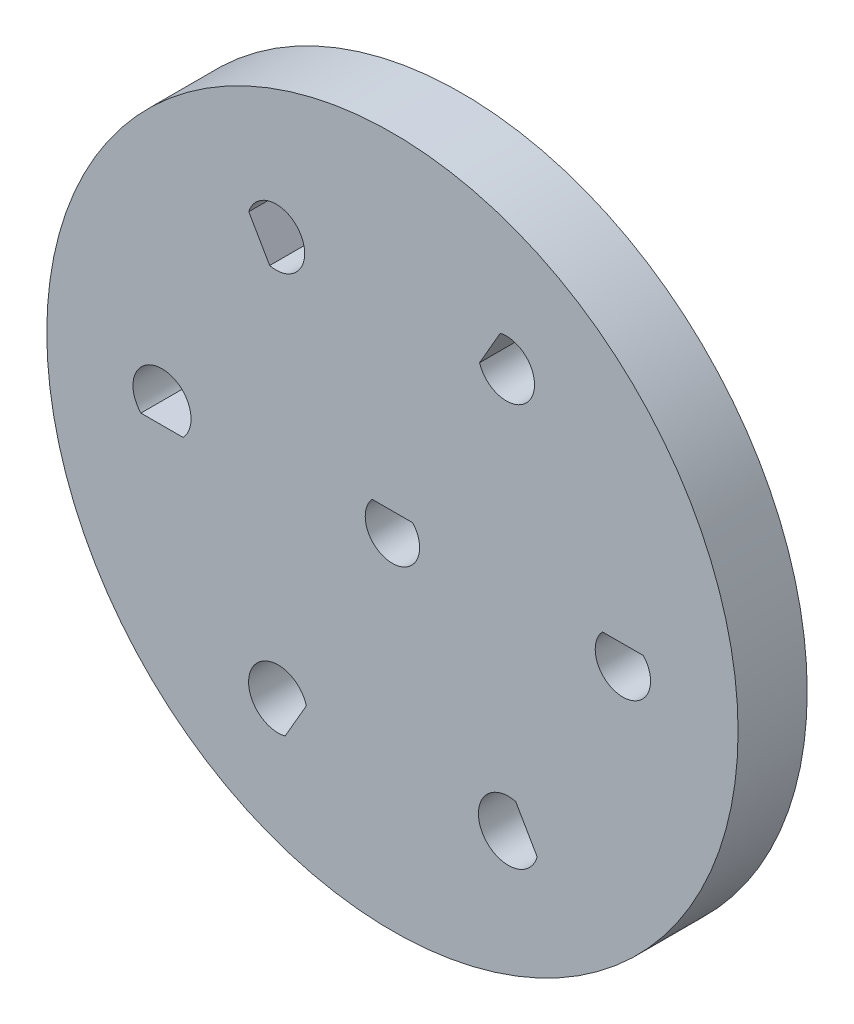
ISO-10303-21;
HEADER;
FILE_DESCRIPTION(('STEP AP214'),'2;1');
FILE_NAME('part.step','',(''),(''),'','','');
FILE_SCHEMA(('AUTOMOTIVE_DESIGN { 1 0 10303 214 1 1 1 1 }'));
ENDSEC;
DATA;
#1=APPLICATION_CONTEXT('core data for automotive mechanical design processes');
#2=APPLICATION_PROTOCOL_DEFINITION('international standard','automotive_design',2000,#1);
#3=PRODUCT_CONTEXT('',#1,'mechanical');
#4=PRODUCT('Part','Part','',(#3));
#5=PRODUCT_RELATED_PRODUCT_CATEGORY('part','',(#4));
#6=PRODUCT_DEFINITION_FORMATION('','',#4);
#7=PRODUCT_DEFINITION_CONTEXT('part definition',#1,'design');
#8=PRODUCT_DEFINITION('design','',#6,#7);
#9=PRODUCT_DEFINITION_SHAPE('','',#8);
#10=(LENGTH_UNIT() NAMED_UNIT(*) SI_UNIT(.MILLI.,.METRE.));
#11=(NAMED_UNIT(*) PLANE_ANGLE_UNIT() SI_UNIT($,.RADIAN.));
#12=(NAMED_UNIT(*) SI_UNIT($,.STERADIAN.) SOLID_ANGLE_UNIT());
#13=UNCERTAINTY_MEASURE_WITH_UNIT(LENGTH_MEASURE(1.E-05),#10,'distance_accuracy_value','');
#14=(GEOMETRIC_REPRESENTATION_CONTEXT(3) GLOBAL_UNCERTAINTY_ASSIGNED_CONTEXT((#13)) GLOBAL_UNIT_ASSIGNED_CONTEXT((#10,
#11,#12)) REPRESENTATION_CONTEXT('',''));
#15=CARTESIAN_POINT('',(0.,0.,0.));
#16=DIRECTION('',(0.,0.,1.));
#17=DIRECTION('',(1.,0.,0.));
#18=AXIS2_PLACEMENT_3D('',#15,#16,#17);
#19=CARTESIAN_POINT('',(0.,0.,3.81));
#20=DIRECTION('',(0.,0.,1.));
#21=DIRECTION('',(1.,0.,0.));
#22=AXIS2_PLACEMENT_3D('',#19,#20,#21);
#23=PLANE('',#22);
#24=DIRECTION('',(0.499999999999999,0.866025403784439,0.));
#25=VECTOR('',#24,1.);
#26=CARTESIAN_POINT('',(-5.9154223854167,-12.6983629560906,3.81));
#27=LINE('',#26,#25);
#28=CARTESIAN_POINT('',(-5.9154223854167,-12.6983629560906,3.81));
#29=VERTEX_POINT('',#28);
#30=CARTESIAN_POINT('',(-4.74281844546084,-10.6673533549316,3.81));
#31=VERTEX_POINT('',#30);
#32=EDGE_CURVE('E155',#29,#31,#27,.T.);
#33=ORIENTED_EDGE('',*,*,#32,.F.);
#34=CARTESIAN_POINT('',(-6.30339899469627,-11.1203581555111,3.81));
#35=DIRECTION('',(0.,0.,1.));
#36=DIRECTION('',(1.,0.,0.));
#37=AXIS2_PLACEMENT_3D('',#34,#35,#36);
#38=CIRCLE('',#37,1.625);
#39=EDGE_CURVE('E152',#31,#29,#38,.T.);
#40=ORIENTED_EDGE('',*,*,#39,.F.);
#41=EDGE_LOOP('',(#33,#40));
#42=FACE_BOUND('',#41,.T.);
#43=DIRECTION('',(0.5,-0.866025403784439,0.));
#44=VECTOR('',#43,1.);
#45=CARTESIAN_POINT('',(-7.9173186737998,11.3278604811709,3.81));
#46=LINE('',#45,#44);
#47=CARTESIAN_POINT('',(-7.9173186737998,11.3278604811709,3.81));
#48=VERTEX_POINT('',#47);
#49=CARTESIAN_POINT('',(-6.76623223047767,9.33412027743322,3.81));
#50=VERTEX_POINT('',#49);
#51=EDGE_CURVE('E189',#48,#50,#46,.T.);
#52=ORIENTED_EDGE('',*,*,#51,.F.);
#53=CARTESIAN_POINT('',(-6.41079814307047,10.8684903793021,3.81));
#54=DIRECTION('',(0.,0.,1.));
#55=DIRECTION('',(1.,0.,0.));
#56=AXIS2_PLACEMENT_3D('',#53,#54,#55);
#57=CIRCLE('',#56,1.575);
#58=EDGE_CURVE('E186',#50,#48,#57,.T.);
#59=ORIENTED_EDGE('',*,*,#58,.F.);
#60=EDGE_LOOP('',(#52,#59));
#61=FACE_BOUND('',#60,.T.);
#62=DIRECTION('',(-1.,0.,0.));
#63=VECTOR('',#62,1.);
#64=CARTESIAN_POINT('',(13.8291589790636,1.01666666666667,3.81));
#65=LINE('',#64,#63);
#66=CARTESIAN_POINT('',(13.8291589790636,1.01666666666667,3.81));
#67=VERTEX_POINT('',#66);
#68=CARTESIAN_POINT('',(11.5708410209364,1.01666666666667,3.81));
#69=VERTEX_POINT('',#68);
#70=EDGE_CURVE('E223',#67,#69,#65,.T.);
#71=ORIENTED_EDGE('',*,*,#70,.F.);
#72=CARTESIAN_POINT('',(12.7,-0.0083333333333335,3.81));
#73=DIRECTION('',(0.,0.,1.));
#74=DIRECTION('',(1.,0.,0.));
#75=AXIS2_PLACEMENT_3D('',#72,#73,#74);
#76=CIRCLE('',#75,1.525);
#77=EDGE_CURVE('E220',#69,#67,#76,.T.);
#78=ORIENTED_EDGE('',*,*,#77,.F.);
#79=EDGE_LOOP('',(#71,#78));
#80=FACE_BOUND('',#79,.T.);
#81=CARTESIAN_POINT('',(0.,0.,3.81));
#82=DIRECTION('',(0.,0.,1.));
#83=DIRECTION('',(1.,0.,0.));
#84=AXIS2_PLACEMENT_3D('',#81,#82,#83);
#85=CIRCLE('',#84,19.05);
#86=CARTESIAN_POINT('',(-19.05,0.,3.81));
#87=VERTEX_POINT('',#86);
#88=EDGE_CURVE('E11',#87,#87,#85,.T.);
#89=ORIENTED_EDGE('',*,*,#88,.T.);
#90=EDGE_LOOP('',(#89));
#91=FACE_BOUND('',#90,.T.);
#92=DIRECTION('',(-1.,0.,0.));
#93=VECTOR('',#92,1.);
#94=CARTESIAN_POINT('',(1.1180339887499,1.,3.81));
#95=LINE('',#94,#93);
#96=CARTESIAN_POINT('',(1.1180339887499,1.,3.81));
#97=VERTEX_POINT('',#96);
#98=CARTESIAN_POINT('',(-1.11803398874989,1.,3.81));
#99=VERTEX_POINT('',#98);
#100=EDGE_CURVE('E240',#97,#99,#95,.T.);
#101=ORIENTED_EDGE('',*,*,#100,.F.);
#102=CARTESIAN_POINT('',(0.,0.,3.81));
#103=DIRECTION('',(0.,0.,1.));
#104=DIRECTION('',(1.,0.,0.));
#105=AXIS2_PLACEMENT_3D('',#102,#103,#104);
#106=CIRCLE('',#105,1.5);
#107=EDGE_CURVE('E237',#99,#97,#106,.T.);
#108=ORIENTED_EDGE('',*,*,#107,.F.);
#109=EDGE_LOOP('',(#101,#108));
#110=FACE_BOUND('',#109,.T.);
#111=DIRECTION('',(-0.5,-0.866025403784439,0.));
#112=VECTOR('',#111,1.);
#113=CARTESIAN_POINT('',(5.94286432662193,12.4552132714004,3.81));
#114=LINE('',#113,#112);
#115=CARTESIAN_POINT('',(5.94286432662193,12.4552132714004,3.81));
#116=VERTEX_POINT('',#115);
#117=CARTESIAN_POINT('',(4.8026889015228,10.4803715055872,3.81));
#118=VERTEX_POINT('',#117);
#119=EDGE_CURVE('E206',#116,#118,#114,.T.);
#120=ORIENTED_EDGE('',*,*,#119,.F.);
#121=CARTESIAN_POINT('',(6.28210328804603,10.9427923884938,3.81));
#122=DIRECTION('',(0.,0.,1.));
#123=DIRECTION('',(1.,0.,0.));
#124=AXIS2_PLACEMENT_3D('',#121,#122,#123);
#125=CIRCLE('',#124,1.55);
#126=EDGE_CURVE('E203',#118,#116,#125,.T.);
#127=ORIENTED_EDGE('',*,*,#126,.F.);
#128=EDGE_LOOP('',(#120,#127));
#129=FACE_BOUND('',#128,.T.);
#130=DIRECTION('',(1.,0.,0.));
#131=VECTOR('',#130,1.);
#132=CARTESIAN_POINT('',(-13.8618950038621,-1.25693735171682,3.81));
#133=LINE('',#132,#131);
#134=CARTESIAN_POINT('',(-13.8618950038621,-1.25693735171682,3.81));
#135=VERTEX_POINT('',#134);
#136=CARTESIAN_POINT('',(-11.5381049961377,-1.25693735171682,3.81));
#137=VERTEX_POINT('',#136);
#138=EDGE_CURVE('E172',#135,#137,#133,.T.);
#139=ORIENTED_EDGE('',*,*,#138,.F.);
#140=CARTESIAN_POINT('',(-12.6999999999999,-0.156937351716822,3.81));
#141=DIRECTION('',(0.,0.,1.));
#142=DIRECTION('',(1.,0.,0.));
#143=AXIS2_PLACEMENT_3D('',#140,#141,#142);
#144=CIRCLE('',#143,1.6);
#145=EDGE_CURVE('E169',#137,#135,#144,.T.);
#146=ORIENTED_EDGE('',*,*,#145,.F.);
#147=EDGE_LOOP('',(#139,#146));
#148=FACE_BOUND('',#147,.T.);
#149=DIRECTION('',(-0.5,0.866025403784438,0.));
#150=VECTOR('',#149,1.);
#151=CARTESIAN_POINT('',(7.97703962908229,-11.5203413868497,3.81));
#152=LINE('',#151,#150);
#153=CARTESIAN_POINT('',(7.97703962908229,-11.5203413868497,3.81));
#154=VERTEX_POINT('',#153);
#155=CARTESIAN_POINT('',(6.79382367246237,-9.47095123365775,3.81));
#156=VERTEX_POINT('',#155);
#157=EDGE_CURVE('E135',#154,#156,#152,.T.);
#158=ORIENTED_EDGE('',*,*,#157,.F.);
#159=CARTESIAN_POINT('',(6.38950243642023,-11.0706463102537,3.81));
#160=DIRECTION('',(0.,0.,1.));
#161=DIRECTION('',(1.,0.,0.));
#162=AXIS2_PLACEMENT_3D('',#159,#160,#161);
#163=CIRCLE('',#162,1.65);
#164=EDGE_CURVE('E141',#156,#154,#163,.T.);
#165=ORIENTED_EDGE('',*,*,#164,.F.);
#166=EDGE_LOOP('',(#158,#165));
#167=FACE_BOUND('',#166,.T.);
#168=ADVANCED_FACE('F35',(#42,#61,#80,#91,#110,#129,#148,#167),#23,.T.);
#169=CARTESIAN_POINT('',(0.,0.,0.));
#170=DIRECTION('',(0.,0.,1.));
#171=DIRECTION('',(1.,0.,0.));
#172=AXIS2_PLACEMENT_3D('',#169,#170,#171);
#173=PLANE('',#172);
#174=CARTESIAN_POINT('',(-6.30339899469627,-11.1203581555111,0.));
#175=DIRECTION('',(0.,0.,1.));
#176=DIRECTION('',(1.,0.,0.));
#177=AXIS2_PLACEMENT_3D('',#174,#175,#176);
#178=CIRCLE('',#177,1.625);
#179=CARTESIAN_POINT('',(-4.74281844546084,-10.6673533549316,0.));
#180=VERTEX_POINT('',#179);
#181=CARTESIAN_POINT('',(-5.9154223854167,-12.6983629560906,0.));
#182=VERTEX_POINT('',#181);
#183=EDGE_CURVE('E151',#180,#182,#178,.T.);
#184=ORIENTED_EDGE('',*,*,#183,.T.);
#185=DIRECTION('',(0.499999999999999,0.866025403784439,0.));
#186=VECTOR('',#185,1.);
#187=CARTESIAN_POINT('',(-5.9154223854167,-12.6983629560906,0.));
#188=LINE('',#187,#186);
#189=EDGE_CURVE('E156',#182,#180,#188,.T.);
#190=ORIENTED_EDGE('',*,*,#189,.T.);
#191=EDGE_LOOP('',(#184,#190));
#192=FACE_BOUND('',#191,.T.);
#193=CARTESIAN_POINT('',(-6.41079814307047,10.8684903793021,0.));
#194=DIRECTION('',(0.,0.,1.));
#195=DIRECTION('',(1.,0.,0.));
#196=AXIS2_PLACEMENT_3D('',#193,#194,#195);
#197=CIRCLE('',#196,1.575);
#198=CARTESIAN_POINT('',(-6.76623223047767,9.33412027743322,0.));
#199=VERTEX_POINT('',#198);
#200=CARTESIAN_POINT('',(-7.9173186737998,11.3278604811709,0.));
#201=VERTEX_POINT('',#200);
#202=EDGE_CURVE('E185',#199,#201,#197,.T.);
#203=ORIENTED_EDGE('',*,*,#202,.T.);
#204=DIRECTION('',(0.5,-0.866025403784439,0.));
#205=VECTOR('',#204,1.);
#206=CARTESIAN_POINT('',(-7.9173186737998,11.3278604811709,0.));
#207=LINE('',#206,#205);
#208=EDGE_CURVE('E190',#201,#199,#207,.T.);
#209=ORIENTED_EDGE('',*,*,#208,.T.);
#210=EDGE_LOOP('',(#203,#209));
#211=FACE_BOUND('',#210,.T.);
#212=CARTESIAN_POINT('',(12.7,-0.0083333333333335,0.));
#213=DIRECTION('',(0.,0.,1.));
#214=DIRECTION('',(1.,0.,0.));
#215=AXIS2_PLACEMENT_3D('',#212,#213,#214);
#216=CIRCLE('',#215,1.525);
#217=CARTESIAN_POINT('',(11.5708410209364,1.01666666666667,0.));
#218=VERTEX_POINT('',#217);
#219=CARTESIAN_POINT('',(13.8291589790636,1.01666666666667,0.));
#220=VERTEX_POINT('',#219);
#221=EDGE_CURVE('E219',#218,#220,#216,.T.);
#222=ORIENTED_EDGE('',*,*,#221,.T.);
#223=DIRECTION('',(-1.,0.,0.));
#224=VECTOR('',#223,1.);
#225=CARTESIAN_POINT('',(13.8291589790636,1.01666666666667,0.));
#226=LINE('',#225,#224);
#227=EDGE_CURVE('E224',#220,#218,#226,.T.);
#228=ORIENTED_EDGE('',*,*,#227,.T.);
#229=EDGE_LOOP('',(#222,#228));
#230=FACE_BOUND('',#229,.T.);
#231=CARTESIAN_POINT('',(0.,0.,0.));
#232=DIRECTION('',(0.,0.,1.));
#233=DIRECTION('',(1.,0.,0.));
#234=AXIS2_PLACEMENT_3D('',#231,#232,#233);
#235=CIRCLE('',#234,19.05);
#236=CARTESIAN_POINT('',(-19.05,0.,0.));
#237=VERTEX_POINT('',#236);
#238=EDGE_CURVE('E39',#237,#237,#235,.T.);
#239=ORIENTED_EDGE('',*,*,#238,.F.);
#240=EDGE_LOOP('',(#239));
#241=FACE_BOUND('',#240,.T.);
#242=CARTESIAN_POINT('',(0.,0.,0.));
#243=DIRECTION('',(0.,0.,1.));
#244=DIRECTION('',(1.,0.,0.));
#245=AXIS2_PLACEMENT_3D('',#242,#243,#244);
#246=CIRCLE('',#245,1.5);
#247=CARTESIAN_POINT('',(-1.11803398874989,1.,0.));
#248=VERTEX_POINT('',#247);
#249=CARTESIAN_POINT('',(1.1180339887499,1.,0.));
#250=VERTEX_POINT('',#249);
#251=EDGE_CURVE('E236',#248,#250,#246,.T.);
#252=ORIENTED_EDGE('',*,*,#251,.T.);
#253=DIRECTION('',(-1.,0.,0.));
#254=VECTOR('',#253,1.);
#255=CARTESIAN_POINT('',(1.1180339887499,1.,0.));
#256=LINE('',#255,#254);
#257=EDGE_CURVE('E241',#250,#248,#256,.T.);
#258=ORIENTED_EDGE('',*,*,#257,.T.);
#259=EDGE_LOOP('',(#252,#258));
#260=FACE_BOUND('',#259,.T.);
#261=CARTESIAN_POINT('',(6.28210328804603,10.9427923884938,0.));
#262=DIRECTION('',(0.,0.,1.));
#263=DIRECTION('',(1.,0.,0.));
#264=AXIS2_PLACEMENT_3D('',#261,#262,#263);
#265=CIRCLE('',#264,1.55);
#266=CARTESIAN_POINT('',(4.8026889015228,10.4803715055872,0.));
#267=VERTEX_POINT('',#266);
#268=CARTESIAN_POINT('',(5.94286432662193,12.4552132714004,0.));
#269=VERTEX_POINT('',#268);
#270=EDGE_CURVE('E202',#267,#269,#265,.T.);
#271=ORIENTED_EDGE('',*,*,#270,.T.);
#272=DIRECTION('',(-0.5,-0.866025403784439,0.));
#273=VECTOR('',#272,1.);
#274=CARTESIAN_POINT('',(5.94286432662193,12.4552132714004,0.));
#275=LINE('',#274,#273);
#276=EDGE_CURVE('E207',#269,#267,#275,.T.);
#277=ORIENTED_EDGE('',*,*,#276,.T.);
#278=EDGE_LOOP('',(#271,#277));
#279=FACE_BOUND('',#278,.T.);
#280=CARTESIAN_POINT('',(-12.6999999999999,-0.156937351716822,0.));
#281=DIRECTION('',(0.,0.,1.));
#282=DIRECTION('',(1.,0.,0.));
#283=AXIS2_PLACEMENT_3D('',#280,#281,#282);
#284=CIRCLE('',#283,1.6);
#285=CARTESIAN_POINT('',(-11.5381049961377,-1.25693735171682,0.));
#286=VERTEX_POINT('',#285);
#287=CARTESIAN_POINT('',(-13.8618950038621,-1.25693735171682,0.));
#288=VERTEX_POINT('',#287);
#289=EDGE_CURVE('E168',#286,#288,#284,.T.);
#290=ORIENTED_EDGE('',*,*,#289,.T.);
#291=DIRECTION('',(1.,0.,0.));
#292=VECTOR('',#291,1.);
#293=CARTESIAN_POINT('',(-13.8618950038621,-1.25693735171682,0.));
#294=LINE('',#293,#292);
#295=EDGE_CURVE('E173',#288,#286,#294,.T.);
#296=ORIENTED_EDGE('',*,*,#295,.T.);
#297=EDGE_LOOP('',(#290,#296));
#298=FACE_BOUND('',#297,.T.);
#299=CARTESIAN_POINT('',(6.38950243642023,-11.0706463102537,0.));
#300=DIRECTION('',(0.,0.,1.));
#301=DIRECTION('',(1.,0.,0.));
#302=AXIS2_PLACEMENT_3D('',#299,#300,#301);
#303=CIRCLE('',#302,1.65);
#304=CARTESIAN_POINT('',(6.79382367246237,-9.47095123365775,0.));
#305=VERTEX_POINT('',#304);
#306=CARTESIAN_POINT('',(7.97703962908229,-11.5203413868497,0.));
#307=VERTEX_POINT('',#306);
#308=EDGE_CURVE('E57',#305,#307,#303,.T.);
#309=ORIENTED_EDGE('',*,*,#308,.T.);
#310=DIRECTION('',(-0.5,0.866025403784438,0.));
#311=VECTOR('',#310,1.);
#312=CARTESIAN_POINT('',(7.97703962908229,-11.5203413868497,0.));
#313=LINE('',#312,#311);
#314=EDGE_CURVE('E145',#307,#305,#313,.T.);
#315=ORIENTED_EDGE('',*,*,#314,.T.);
#316=EDGE_LOOP('',(#309,#315));
#317=FACE_BOUND('',#316,.T.);
#318=ADVANCED_FACE('F257',(#192,#211,#230,#241,#260,#279,#298,#317),#173,.F.);
#319=CARTESIAN_POINT('',(0.,0.,3.81));
#320=DIRECTION('',(0.,0.,-1.));
#321=DIRECTION('',(-1.,0.,0.));
#322=AXIS2_PLACEMENT_3D('',#319,#320,#321);
#323=CYLINDRICAL_SURFACE('',#322,19.05);
#324=CARTESIAN_POINT('',(-19.05,0.,3.81));
#325=CARTESIAN_POINT('',(-19.05,0.,3.7703125));
#326=CARTESIAN_POINT('',(-19.05,0.,3.730625));
#327=CARTESIAN_POINT('',(-19.05,0.,3.65125));
#328=CARTESIAN_POINT('',(-19.05,0.,3.6115625));
#329=CARTESIAN_POINT('',(-19.05,0.,3.5321875));
#330=CARTESIAN_POINT('',(-19.05,0.,3.4925));
#331=CARTESIAN_POINT('',(-19.05,0.,3.413125));
#332=CARTESIAN_POINT('',(-19.05,0.,3.3734375));
#333=CARTESIAN_POINT('',(-19.05,0.,3.2940625));
#334=CARTESIAN_POINT('',(-19.05,0.,3.254375));
#335=CARTESIAN_POINT('',(-19.05,0.,3.175));
#336=CARTESIAN_POINT('',(-19.05,0.,3.1353125));
#337=CARTESIAN_POINT('',(-19.05,0.,3.0559375));
#338=CARTESIAN_POINT('',(-19.05,0.,3.01625));
#339=CARTESIAN_POINT('',(-19.05,0.,2.936875));
#340=CARTESIAN_POINT('',(-19.05,0.,2.8971875));
#341=CARTESIAN_POINT('',(-19.05,0.,2.8178125));
#342=CARTESIAN_POINT('',(-19.05,0.,2.778125));
#343=CARTESIAN_POINT('',(-19.05,0.,2.69875));
#344=CARTESIAN_POINT('',(-19.05,0.,2.6590625));
#345=CARTESIAN_POINT('',(-19.05,0.,2.5796875));
#346=CARTESIAN_POINT('',(-19.05,0.,2.54));
#347=CARTESIAN_POINT('',(-19.05,0.,2.460625));
#348=CARTESIAN_POINT('',(-19.05,0.,2.4209375));
#349=CARTESIAN_POINT('',(-19.05,0.,2.3415625));
#350=CARTESIAN_POINT('',(-19.05,0.,2.301875));
#351=CARTESIAN_POINT('',(-19.05,0.,2.2225));
#352=CARTESIAN_POINT('',(-19.05,0.,2.1828125));
#353=CARTESIAN_POINT('',(-19.05,0.,2.1034375));
#354=CARTESIAN_POINT('',(-19.05,0.,2.06375));
#355=CARTESIAN_POINT('',(-19.05,0.,1.984375));
#356=CARTESIAN_POINT('',(-19.05,0.,1.9446875));
#357=CARTESIAN_POINT('',(-19.05,0.,1.8653125));
#358=CARTESIAN_POINT('',(-19.05,0.,1.825625));
#359=CARTESIAN_POINT('',(-19.05,0.,1.74625));
#360=CARTESIAN_POINT('',(-19.05,0.,1.7065625));
#361=CARTESIAN_POINT('',(-19.05,0.,1.6271875));
#362=CARTESIAN_POINT('',(-19.05,0.,1.5875));
#363=CARTESIAN_POINT('',(-19.05,0.,1.508125));
#364=CARTESIAN_POINT('',(-19.05,0.,1.4684375));
#365=CARTESIAN_POINT('',(-19.05,0.,1.3890625));
#366=CARTESIAN_POINT('',(-19.05,0.,1.349375));
#367=CARTESIAN_POINT('',(-19.05,0.,1.27));
#368=CARTESIAN_POINT('',(-19.05,0.,1.2303125));
#369=CARTESIAN_POINT('',(-19.05,0.,1.1509375));
#370=CARTESIAN_POINT('',(-19.05,0.,1.11125));
#371=CARTESIAN_POINT('',(-19.05,0.,1.031875));
#372=CARTESIAN_POINT('',(-19.05,0.,0.9921875));
#373=CARTESIAN_POINT('',(-19.05,0.,0.9128125));
#374=CARTESIAN_POINT('',(-19.05,0.,0.873125));
#375=CARTESIAN_POINT('',(-19.05,0.,0.79375));
#376=CARTESIAN_POINT('',(-19.05,0.,0.7540625));
#377=CARTESIAN_POINT('',(-19.05,0.,0.6746875));
#378=CARTESIAN_POINT('',(-19.05,0.,0.635));
#379=CARTESIAN_POINT('',(-19.05,0.,0.555625));
#380=CARTESIAN_POINT('',(-19.05,0.,0.5159375));
#381=CARTESIAN_POINT('',(-19.05,0.,0.4365625));
#382=CARTESIAN_POINT('',(-19.05,0.,0.396875));
#383=CARTESIAN_POINT('',(-19.05,0.,0.3175));
#384=CARTESIAN_POINT('',(-19.05,0.,0.2778125));
#385=CARTESIAN_POINT('',(-19.05,0.,0.1984375));
#386=CARTESIAN_POINT('',(-19.05,0.,0.15875));
#387=CARTESIAN_POINT('',(-19.05,0.,0.0793749999999999));
#388=CARTESIAN_POINT('',(-19.05,0.,0.0396874999999999));
#389=CARTESIAN_POINT('',(-19.05,0.,0.));
#390=B_SPLINE_CURVE_WITH_KNOTS('',3,(#324,#325,#326,#327,#328,#329,#330,#331,#332,#333,#334,
#335,#336,#337,#338,#339,#340,#341,#342,#343,#344,#345,#346,#347,#348,#349,#350,#351,#352,#353,
#354,#355,#356,#357,#358,#359,#360,#361,#362,#363,#364,#365,#366,#367,#368,#369,#370,#371,#372,
#373,#374,#375,#376,#377,#378,#379,#380,#381,#382,#383,#384,#385,#386,#387,#388,#389),
.UNSPECIFIED.,.F.,.F.,(4,2,2,2,2,2,2,2,2,2,2,2,2,2,2,2,2,2,2,2,2,2,2,2,2,2,2,2,2,2,2,2,4),(0.,
0.1190625,0.238125,0.3571875,0.47625,0.5953125,0.714375,0.8334375,0.9525,1.0715625,1.190625,
1.3096875,1.42875,1.5478125,1.666875,1.7859375,1.905,2.0240625,2.143125,2.2621875,2.38125,
2.5003125,2.619375,2.7384375,2.8575,2.9765625,3.095625,3.2146875,3.33375,3.4528125,3.571875,
3.6909375,3.81),.UNSPECIFIED.);
#391=EDGE_CURVE('BSEAM37',#87,#237,#390,.T.);
#392=ORIENTED_EDGE('',*,*,#88,.F.);
#393=ORIENTED_EDGE('',*,*,#238,.T.);
#394=ORIENTED_EDGE('',*,*,#391,.T.);
#395=ORIENTED_EDGE('',*,*,#391,.F.);
#396=EDGE_LOOP('',(#392,#394,#393,#395));
#397=FACE_BOUND('',#396,.T.);
#398=ADVANCED_FACE('F37',(#397),#323,.T.);
#399=CARTESIAN_POINT('',(0.,0.,3.81));
#400=DIRECTION('',(0.,0.,-1.));
#401=DIRECTION('',(-1.,0.,0.));
#402=AXIS2_PLACEMENT_3D('',#399,#400,#401);
#403=CYLINDRICAL_SURFACE('',#402,1.5);
#404=ORIENTED_EDGE('',*,*,#251,.F.);
#405=DIRECTION('',(0.,0.,-1.));
#406=VECTOR('',#405,1.);
#407=CARTESIAN_POINT('',(-1.11803398874989,1.,3.81));
#408=LINE('',#407,#406);
#409=EDGE_CURVE('E243',#99,#248,#408,.T.);
#410=ORIENTED_EDGE('',*,*,#409,.F.);
#411=ORIENTED_EDGE('',*,*,#107,.T.);
#412=DIRECTION('',(0.,0.,-1.));
#413=VECTOR('',#412,1.);
#414=CARTESIAN_POINT('',(1.1180339887499,1.,3.81));
#415=LINE('',#414,#413);
#416=EDGE_CURVE('E250',#97,#250,#415,.T.);
#417=ORIENTED_EDGE('',*,*,#416,.T.);
#418=EDGE_LOOP('',(#404,#410,#411,#417));
#419=FACE_BOUND('',#418,.T.);
#420=ADVANCED_FACE('F280',(#419),#403,.F.);
#421=CARTESIAN_POINT('',(1.1180339887499,1.,3.81));
#422=DIRECTION('',(0.,-1.,0.));
#423=DIRECTION('',(0.,0.,-1.));
#424=AXIS2_PLACEMENT_3D('',#421,#422,#423);
#425=PLANE('',#424);
#426=ORIENTED_EDGE('',*,*,#257,.F.);
#427=ORIENTED_EDGE('',*,*,#416,.F.);
#428=ORIENTED_EDGE('',*,*,#100,.T.);
#429=ORIENTED_EDGE('',*,*,#409,.T.);
#430=EDGE_LOOP('',(#426,#427,#428,#429));
#431=FACE_BOUND('',#430,.T.);
#432=ADVANCED_FACE('F283',(#431),#425,.T.);
#433=CARTESIAN_POINT('',(12.7,-0.0083333333333335,3.81));
#434=DIRECTION('',(0.,0.,-1.));
#435=DIRECTION('',(-1.,0.,0.));
#436=AXIS2_PLACEMENT_3D('',#433,#434,#435);
#437=CYLINDRICAL_SURFACE('',#436,1.525);
#438=ORIENTED_EDGE('',*,*,#221,.F.);
#439=DIRECTION('',(0.,0.,-1.));
#440=VECTOR('',#439,1.);
#441=CARTESIAN_POINT('',(11.5708410209364,1.01666666666667,3.81));
#442=LINE('',#441,#440);
#443=EDGE_CURVE('E226',#69,#218,#442,.T.);
#444=ORIENTED_EDGE('',*,*,#443,.F.);
#445=ORIENTED_EDGE('',*,*,#77,.T.);
#446=DIRECTION('',(0.,0.,-1.));
#447=VECTOR('',#446,1.);
#448=CARTESIAN_POINT('',(13.8291589790636,1.01666666666667,3.81));
#449=LINE('',#448,#447);
#450=EDGE_CURVE('E233',#67,#220,#449,.T.);
#451=ORIENTED_EDGE('',*,*,#450,.T.);
#452=EDGE_LOOP('',(#438,#444,#445,#451));
#453=FACE_BOUND('',#452,.T.);
#454=ADVANCED_FACE('F286',(#453),#437,.F.);
#455=CARTESIAN_POINT('',(13.8291589790636,1.01666666666667,3.81));
#456=DIRECTION('',(0.,-1.,0.));
#457=DIRECTION('',(0.,0.,-1.));
#458=AXIS2_PLACEMENT_3D('',#455,#456,#457);
#459=PLANE('',#458);
#460=ORIENTED_EDGE('',*,*,#227,.F.);
#461=ORIENTED_EDGE('',*,*,#450,.F.);
#462=ORIENTED_EDGE('',*,*,#70,.T.);
#463=ORIENTED_EDGE('',*,*,#443,.T.);
#464=EDGE_LOOP('',(#460,#461,#462,#463));
#465=FACE_BOUND('',#464,.T.);
#466=ADVANCED_FACE('F290',(#465),#459,.T.);
#467=CARTESIAN_POINT('',(6.28210328804603,10.9427923884938,3.81));
#468=DIRECTION('',(0.,0.,-1.));
#469=DIRECTION('',(-1.,0.,0.));
#470=AXIS2_PLACEMENT_3D('',#467,#468,#469);
#471=CYLINDRICAL_SURFACE('',#470,1.55);
#472=ORIENTED_EDGE('',*,*,#270,.F.);
#473=DIRECTION('',(0.,0.,-1.));
#474=VECTOR('',#473,1.);
#475=CARTESIAN_POINT('',(4.8026889015228,10.4803715055872,3.81));
#476=LINE('',#475,#474);
#477=EDGE_CURVE('E209',#118,#267,#476,.T.);
#478=ORIENTED_EDGE('',*,*,#477,.F.);
#479=ORIENTED_EDGE('',*,*,#126,.T.);
#480=DIRECTION('',(0.,0.,-1.));
#481=VECTOR('',#480,1.);
#482=CARTESIAN_POINT('',(5.94286432662193,12.4552132714004,3.81));
#483=LINE('',#482,#481);
#484=EDGE_CURVE('E216',#116,#269,#483,.T.);
#485=ORIENTED_EDGE('',*,*,#484,.T.);
#486=EDGE_LOOP('',(#472,#478,#479,#485));
#487=FACE_BOUND('',#486,.T.);
#488=ADVANCED_FACE('F294',(#487),#471,.F.);
#489=CARTESIAN_POINT('',(5.94286432662193,12.4552132714004,3.81));
#490=DIRECTION('',(0.866025403784439,-0.5,0.));
#491=DIRECTION('',(0.5,0.866025403784439,0.));
#492=AXIS2_PLACEMENT_3D('',#489,#490,#491);
#493=PLANE('',#492);
#494=ORIENTED_EDGE('',*,*,#276,.F.);
#495=ORIENTED_EDGE('',*,*,#484,.F.);
#496=ORIENTED_EDGE('',*,*,#119,.T.);
#497=ORIENTED_EDGE('',*,*,#477,.T.);
#498=EDGE_LOOP('',(#494,#495,#496,#497));
#499=FACE_BOUND('',#498,.T.);
#500=ADVANCED_FACE('F298',(#499),#493,.T.);
#501=CARTESIAN_POINT('',(-6.41079814307047,10.8684903793021,3.81));
#502=DIRECTION('',(0.,0.,-1.));
#503=DIRECTION('',(-1.,0.,0.));
#504=AXIS2_PLACEMENT_3D('',#501,#502,#503);
#505=CYLINDRICAL_SURFACE('',#504,1.575);
#506=ORIENTED_EDGE('',*,*,#202,.F.);
#507=DIRECTION('',(0.,0.,-1.));
#508=VECTOR('',#507,1.);
#509=CARTESIAN_POINT('',(-6.76623223047767,9.33412027743322,3.81));
#510=LINE('',#509,#508);
#511=EDGE_CURVE('E192',#50,#199,#510,.T.);
#512=ORIENTED_EDGE('',*,*,#511,.F.);
#513=ORIENTED_EDGE('',*,*,#58,.T.);
#514=DIRECTION('',(0.,0.,-1.));
#515=VECTOR('',#514,1.);
#516=CARTESIAN_POINT('',(-7.9173186737998,11.3278604811709,3.81));
#517=LINE('',#516,#515);
#518=EDGE_CURVE('E199',#48,#201,#517,.T.);
#519=ORIENTED_EDGE('',*,*,#518,.T.);
#520=EDGE_LOOP('',(#506,#512,#513,#519));
#521=FACE_BOUND('',#520,.T.);
#522=ADVANCED_FACE('F302',(#521),#505,.F.);
#523=CARTESIAN_POINT('',(-7.9173186737998,11.3278604811709,3.81));
#524=DIRECTION('',(0.866025403784439,0.5,0.));
#525=DIRECTION('',(-0.5,0.866025403784439,0.));
#526=AXIS2_PLACEMENT_3D('',#523,#524,#525);
#527=PLANE('',#526);
#528=ORIENTED_EDGE('',*,*,#208,.F.);
#529=ORIENTED_EDGE('',*,*,#518,.F.);
#530=ORIENTED_EDGE('',*,*,#51,.T.);
#531=ORIENTED_EDGE('',*,*,#511,.T.);
#532=EDGE_LOOP('',(#528,#529,#530,#531));
#533=FACE_BOUND('',#532,.T.);
#534=ADVANCED_FACE('F306',(#533),#527,.T.);
#535=CARTESIAN_POINT('',(-12.6999999999999,-0.156937351716822,3.81));
#536=DIRECTION('',(0.,0.,-1.));
#537=DIRECTION('',(-1.,0.,0.));
#538=AXIS2_PLACEMENT_3D('',#535,#536,#537);
#539=CYLINDRICAL_SURFACE('',#538,1.6);
#540=ORIENTED_EDGE('',*,*,#289,.F.);
#541=DIRECTION('',(0.,0.,-1.));
#542=VECTOR('',#541,1.);
#543=CARTESIAN_POINT('',(-11.5381049961377,-1.25693735171682,3.81));
#544=LINE('',#543,#542);
#545=EDGE_CURVE('E175',#137,#286,#544,.T.);
#546=ORIENTED_EDGE('',*,*,#545,.F.);
#547=ORIENTED_EDGE('',*,*,#145,.T.);
#548=DIRECTION('',(0.,0.,-1.));
#549=VECTOR('',#548,1.);
#550=CARTESIAN_POINT('',(-13.8618950038621,-1.25693735171682,3.81));
#551=LINE('',#550,#549);
#552=EDGE_CURVE('E182',#135,#288,#551,.T.);
#553=ORIENTED_EDGE('',*,*,#552,.T.);
#554=EDGE_LOOP('',(#540,#546,#547,#553));
#555=FACE_BOUND('',#554,.T.);
#556=ADVANCED_FACE('F266',(#555),#539,.F.);
#557=CARTESIAN_POINT('',(-13.8618950038621,-1.25693735171682,3.81));
#558=DIRECTION('',(0.,1.,0.));
#559=DIRECTION('',(0.,0.,1.));
#560=AXIS2_PLACEMENT_3D('',#557,#558,#559);
#561=PLANE('',#560);
#562=ORIENTED_EDGE('',*,*,#295,.F.);
#563=ORIENTED_EDGE('',*,*,#552,.F.);
#564=ORIENTED_EDGE('',*,*,#138,.T.);
#565=ORIENTED_EDGE('',*,*,#545,.T.);
#566=EDGE_LOOP('',(#562,#563,#564,#565));
#567=FACE_BOUND('',#566,.T.);
#568=ADVANCED_FACE('F269',(#567),#561,.T.);
#569=CARTESIAN_POINT('',(-6.30339899469627,-11.1203581555111,3.81));
#570=DIRECTION('',(0.,0.,-1.));
#571=DIRECTION('',(-1.,0.,0.));
#572=AXIS2_PLACEMENT_3D('',#569,#570,#571);
#573=CYLINDRICAL_SURFACE('',#572,1.625);
#574=ORIENTED_EDGE('',*,*,#183,.F.);
#575=DIRECTION('',(0.,0.,-1.));
#576=VECTOR('',#575,1.);
#577=CARTESIAN_POINT('',(-4.74281844546084,-10.6673533549316,3.81));
#578=LINE('',#577,#576);
#579=EDGE_CURVE('E158',#31,#180,#578,.T.);
#580=ORIENTED_EDGE('',*,*,#579,.F.);
#581=ORIENTED_EDGE('',*,*,#39,.T.);
#582=DIRECTION('',(0.,0.,-1.));
#583=VECTOR('',#582,1.);
#584=CARTESIAN_POINT('',(-5.9154223854167,-12.6983629560906,3.81));
#585=LINE('',#584,#583);
#586=EDGE_CURVE('E165',#29,#182,#585,.T.);
#587=ORIENTED_EDGE('',*,*,#586,.T.);
#588=EDGE_LOOP('',(#574,#580,#581,#587));
#589=FACE_BOUND('',#588,.T.);
#590=ADVANCED_FACE('F315',(#589),#573,.F.);
#591=CARTESIAN_POINT('',(-5.9154223854167,-12.6983629560906,3.81));
#592=DIRECTION('',(-0.866025403784439,0.499999999999999,0.));
#593=DIRECTION('',(-0.499999999999999,-0.866025403784439,0.));
#594=AXIS2_PLACEMENT_3D('',#591,#592,#593);
#595=PLANE('',#594);
#596=ORIENTED_EDGE('',*,*,#189,.F.);
#597=ORIENTED_EDGE('',*,*,#586,.F.);
#598=ORIENTED_EDGE('',*,*,#32,.T.);
#599=ORIENTED_EDGE('',*,*,#579,.T.);
#600=EDGE_LOOP('',(#596,#597,#598,#599));
#601=FACE_BOUND('',#600,.T.);
#602=ADVANCED_FACE('F318',(#601),#595,.T.);
#603=CARTESIAN_POINT('',(6.38950243642023,-11.0706463102537,3.81));
#604=DIRECTION('',(0.,0.,-1.));
#605=DIRECTION('',(-1.,0.,0.));
#606=AXIS2_PLACEMENT_3D('',#603,#604,#605);
#607=CYLINDRICAL_SURFACE('',#606,1.65);
#608=ORIENTED_EDGE('',*,*,#308,.F.);
#609=DIRECTION('',(0.,0.,-1.));
#610=VECTOR('',#609,1.);
#611=CARTESIAN_POINT('',(6.79382367246237,-9.47095123365775,3.81));
#612=LINE('',#611,#610);
#613=EDGE_CURVE('E137',#156,#305,#612,.T.);
#614=ORIENTED_EDGE('',*,*,#613,.F.);
#615=ORIENTED_EDGE('',*,*,#164,.T.);
#616=DIRECTION('',(0.,0.,-1.));
#617=VECTOR('',#616,1.);
#618=CARTESIAN_POINT('',(7.97703962908229,-11.5203413868497,3.81));
#619=LINE('',#618,#617);
#620=EDGE_CURVE('E50',#154,#307,#619,.T.);
#621=ORIENTED_EDGE('',*,*,#620,.T.);
#622=EDGE_LOOP('',(#608,#614,#615,#621));
#623=FACE_BOUND('',#622,.T.);
#624=ADVANCED_FACE('F143',(#623),#607,.F.);
#625=CARTESIAN_POINT('',(7.97703962908229,-11.5203413868497,3.81));
#626=DIRECTION('',(-0.866025403784438,-0.5,0.));
#627=DIRECTION('',(0.5,-0.866025403784438,0.));
#628=AXIS2_PLACEMENT_3D('',#625,#626,#627);
#629=PLANE('',#628);
#630=ORIENTED_EDGE('',*,*,#314,.F.);
#631=ORIENTED_EDGE('',*,*,#620,.F.);
#632=ORIENTED_EDGE('',*,*,#157,.T.);
#633=ORIENTED_EDGE('',*,*,#613,.T.);
#634=EDGE_LOOP('',(#630,#631,#632,#633));
#635=FACE_BOUND('',#634,.T.);
#636=ADVANCED_FACE('F136',(#635),#629,.T.);
#637=CLOSED_SHELL('',(#168,#318,#398,#420,#432,#454,#466,#488,#500,#522,#534,#556,#568,#590,
#602,#624,#636));
#638=MANIFOLD_SOLID_BREP('B2',#637);
#639=ADVANCED_BREP_SHAPE_REPRESENTATION('',(#18,#638),#14);
#640=SHAPE_DEFINITION_REPRESENTATION(#9,#639);
ENDSEC;
END-ISO-10303-21;
